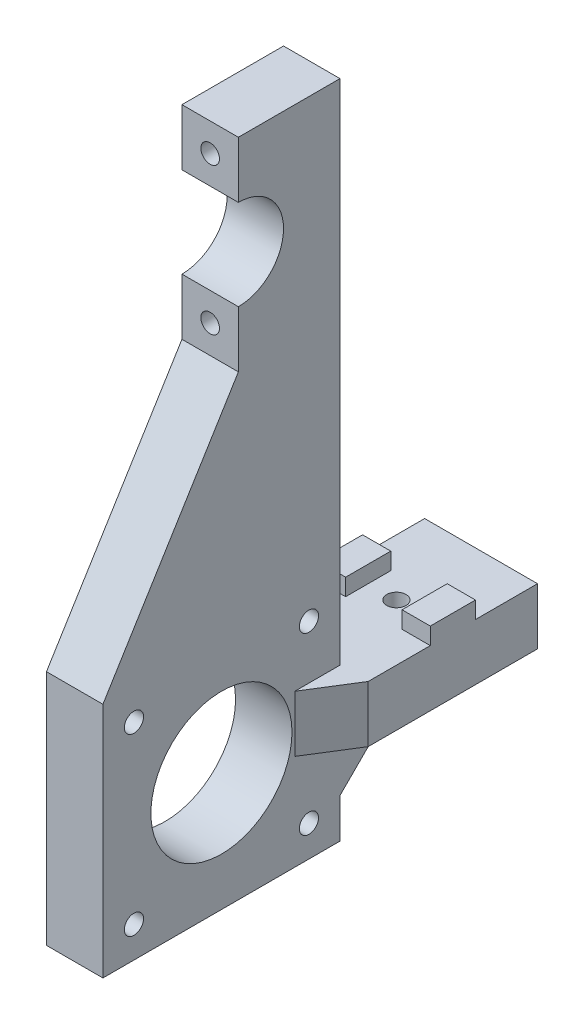
ISO-10303-21;
HEADER;
FILE_DESCRIPTION(('STEP AP214'),'2;1');
FILE_NAME('part.step','',(''),(''),'','','');
FILE_SCHEMA(('AUTOMOTIVE_DESIGN { 1 0 10303 214 1 1 1 1 }'));
ENDSEC;
DATA;
#1=APPLICATION_CONTEXT('core data for automotive mechanical design processes');
#2=APPLICATION_PROTOCOL_DEFINITION('international standard','automotive_design',2000,#1);
#3=PRODUCT_CONTEXT('',#1,'mechanical');
#4=PRODUCT('Part','Part','',(#3));
#5=PRODUCT_RELATED_PRODUCT_CATEGORY('part','',(#4));
#6=PRODUCT_DEFINITION_FORMATION('','',#4);
#7=PRODUCT_DEFINITION_CONTEXT('part definition',#1,'design');
#8=PRODUCT_DEFINITION('design','',#6,#7);
#9=PRODUCT_DEFINITION_SHAPE('','',#8);
#10=(LENGTH_UNIT() NAMED_UNIT(*) SI_UNIT(.MILLI.,.METRE.));
#11=(NAMED_UNIT(*) PLANE_ANGLE_UNIT() SI_UNIT($,.RADIAN.));
#12=(NAMED_UNIT(*) SI_UNIT($,.STERADIAN.) SOLID_ANGLE_UNIT());
#13=UNCERTAINTY_MEASURE_WITH_UNIT(LENGTH_MEASURE(1.E-05),#10,'distance_accuracy_value','');
#14=(GEOMETRIC_REPRESENTATION_CONTEXT(3) GLOBAL_UNCERTAINTY_ASSIGNED_CONTEXT((#13)) GLOBAL_UNIT_ASSIGNED_CONTEXT((#10,
#11,#12)) REPRESENTATION_CONTEXT('',''));
#15=CARTESIAN_POINT('',(0.,0.,0.));
#16=DIRECTION('',(0.,0.,1.));
#17=DIRECTION('',(1.,0.,0.));
#18=AXIS2_PLACEMENT_3D('',#15,#16,#17);
#19=CARTESIAN_POINT('',(5.,72.,18.));
#20=DIRECTION('',(1.,0.,0.));
#21=DIRECTION('',(0.,0.,-1.));
#22=AXIS2_PLACEMENT_3D('',#19,#20,#21);
#23=PLANE('',#22);
#24=CARTESIAN_POINT('',(5.,9.5,36.5));
#25=DIRECTION('',(-1.,0.,0.));
#26=DIRECTION('',(0.,0.,1.));
#27=AXIS2_PLACEMENT_3D('',#24,#25,#26);
#28=CIRCLE('',#27,3.15);
#29=CARTESIAN_POINT('',(5.,9.5,39.65));
#30=VERTEX_POINT('',#29);
#31=EDGE_CURVE('E248',#30,#30,#28,.T.);
#32=ORIENTED_EDGE('',*,*,#31,.F.);
#33=EDGE_LOOP('',(#32));
#34=FACE_BOUND('',#33,.T.);
#35=CARTESIAN_POINT('',(5.,-21.5,36.5));
#36=DIRECTION('',(-1.,0.,0.));
#37=DIRECTION('',(0.,0.,1.));
#38=AXIS2_PLACEMENT_3D('',#35,#36,#37);
#39=CIRCLE('',#38,3.15);
#40=CARTESIAN_POINT('',(5.,-21.5,39.65));
#41=VERTEX_POINT('',#40);
#42=EDGE_CURVE('E257',#41,#41,#39,.T.);
#43=ORIENTED_EDGE('',*,*,#42,.F.);
#44=EDGE_LOOP('',(#43));
#45=FACE_BOUND('',#44,.T.);
#46=CARTESIAN_POINT('',(5.,-21.5,5.5));
#47=DIRECTION('',(-1.,0.,0.));
#48=DIRECTION('',(0.,0.,1.));
#49=AXIS2_PLACEMENT_3D('',#46,#47,#48);
#50=CIRCLE('',#49,3.15);
#51=CARTESIAN_POINT('',(5.,-21.5,8.65));
#52=VERTEX_POINT('',#51);
#53=EDGE_CURVE('E266',#52,#52,#50,.T.);
#54=ORIENTED_EDGE('',*,*,#53,.F.);
#55=EDGE_LOOP('',(#54));
#56=FACE_BOUND('',#55,.T.);
#57=CARTESIAN_POINT('',(5.,-6.,21.));
#58=DIRECTION('',(1.,0.,0.));
#59=DIRECTION('',(0.,0.,-1.));
#60=AXIS2_PLACEMENT_3D('',#57,#58,#59);
#61=CIRCLE('',#60,12.5);
#62=CARTESIAN_POINT('',(5.,-6.,8.5));
#63=VERTEX_POINT('',#62);
#64=EDGE_CURVE('E269',#63,#63,#61,.T.);
#65=ORIENTED_EDGE('',*,*,#64,.T.);
#66=EDGE_LOOP('',(#65));
#67=FACE_BOUND('',#66,.T.);
#68=DIRECTION('',(0.,0.,1.));
#69=VECTOR('',#68,1.);
#70=CARTESIAN_POINT('',(5.,-10.,0.));
#71=LINE('',#70,#69);
#72=CARTESIAN_POINT('',(5.,-10.,-10.));
#73=VERTEX_POINT('',#72);
#74=CARTESIAN_POINT('',(5.,-10.,8.));
#75=VERTEX_POINT('',#74);
#76=EDGE_CURVE('E404',#73,#75,#71,.T.);
#77=ORIENTED_EDGE('',*,*,#76,.F.);
#78=DIRECTION('',(0.,0.707106781186548,-0.707106781186547));
#79=VECTOR('',#78,1.);
#80=CARTESIAN_POINT('',(5.,-10.,-10.));
#81=LINE('',#80,#79);
#82=CARTESIAN_POINT('',(5.,-20.,0.));
#83=VERTEX_POINT('',#82);
#84=EDGE_CURVE('E334',#83,#73,#81,.T.);
#85=ORIENTED_EDGE('',*,*,#84,.F.);
#86=DIRECTION('',(0.,1.,0.));
#87=VECTOR('',#86,1.);
#88=CARTESIAN_POINT('',(5.,-20.,0.));
#89=LINE('',#88,#87);
#90=CARTESIAN_POINT('',(5.,-27.,0.));
#91=VERTEX_POINT('',#90);
#92=EDGE_CURVE('E371',#91,#83,#89,.T.);
#93=ORIENTED_EDGE('',*,*,#92,.F.);
#94=DIRECTION('',(0.,0.,-1.));
#95=VECTOR('',#94,1.);
#96=CARTESIAN_POINT('',(5.,-27.,42.));
#97=LINE('',#96,#95);
#98=CARTESIAN_POINT('',(5.,-27.,42.));
#99=VERTEX_POINT('',#98);
#100=EDGE_CURVE('E369',#99,#91,#97,.T.);
#101=ORIENTED_EDGE('',*,*,#100,.F.);
#102=DIRECTION('',(0.,-1.,0.));
#103=VECTOR('',#102,1.);
#104=CARTESIAN_POINT('',(5.,15.,42.));
#105=LINE('',#104,#103);
#106=CARTESIAN_POINT('',(5.,15.,42.));
#107=VERTEX_POINT('',#106);
#108=EDGE_CURVE('E367',#107,#99,#105,.T.);
#109=ORIENTED_EDGE('',*,*,#108,.F.);
#110=DIRECTION('',(0.,-0.851658316704544,0.524097425664335));
#111=VECTOR('',#110,1.);
#112=CARTESIAN_POINT('',(5.,54.,18.));
#113=LINE('',#112,#111);
#114=CARTESIAN_POINT('',(5.,54.,18.));
#115=VERTEX_POINT('',#114);
#116=EDGE_CURVE('E365',#115,#107,#113,.T.);
#117=ORIENTED_EDGE('',*,*,#116,.F.);
#118=DIRECTION('',(0.,-1.,0.));
#119=VECTOR('',#118,1.);
#120=CARTESIAN_POINT('',(5.,64.,18.));
#121=LINE('',#120,#119);
#122=CARTESIAN_POINT('',(5.,64.,18.));
#123=VERTEX_POINT('',#122);
#124=EDGE_CURVE('E363',#123,#115,#121,.T.);
#125=ORIENTED_EDGE('',*,*,#124,.F.);
#126=CARTESIAN_POINT('',(5.,72.,18.));
#127=DIRECTION('',(-1.,0.,0.));
#128=DIRECTION('',(0.,0.,-1.));
#129=AXIS2_PLACEMENT_3D('',#126,#127,#128);
#130=CIRCLE('',#129,8.00000000000001);
#131=CARTESIAN_POINT('',(5.,80.,18.));
#132=VERTEX_POINT('',#131);
#133=EDGE_CURVE('E361',#132,#123,#130,.T.);
#134=ORIENTED_EDGE('',*,*,#133,.F.);
#135=DIRECTION('',(0.,-1.,0.));
#136=VECTOR('',#135,1.);
#137=CARTESIAN_POINT('',(5.,90.,18.));
#138=LINE('',#137,#136);
#139=CARTESIAN_POINT('',(5.,90.,18.));
#140=VERTEX_POINT('',#139);
#141=EDGE_CURVE('E359',#140,#132,#138,.T.);
#142=ORIENTED_EDGE('',*,*,#141,.F.);
#143=DIRECTION('',(0.,0.,1.));
#144=VECTOR('',#143,1.);
#145=CARTESIAN_POINT('',(5.,90.,0.));
#146=LINE('',#145,#144);
#147=CARTESIAN_POINT('',(5.,90.,0.));
#148=VERTEX_POINT('',#147);
#149=EDGE_CURVE('E357',#148,#140,#146,.T.);
#150=ORIENTED_EDGE('',*,*,#149,.F.);
#151=DIRECTION('',(0.,1.,0.));
#152=VECTOR('',#151,1.);
#153=CARTESIAN_POINT('',(5.,90.,0.));
#154=LINE('',#153,#152);
#155=CARTESIAN_POINT('',(5.,0.,0.));
#156=VERTEX_POINT('',#155);
#157=EDGE_CURVE('E330',#156,#148,#154,.T.);
#158=ORIENTED_EDGE('',*,*,#157,.F.);
#159=DIRECTION('',(0.,0.,1.));
#160=VECTOR('',#159,1.);
#161=CARTESIAN_POINT('',(5.,0.,0.));
#162=LINE('',#161,#160);
#163=CARTESIAN_POINT('',(5.,0.,8.));
#164=VERTEX_POINT('',#163);
#165=EDGE_CURVE('E438',#156,#164,#162,.T.);
#166=ORIENTED_EDGE('',*,*,#165,.T.);
#167=DIRECTION('',(0.,1.,0.));
#168=VECTOR('',#167,1.);
#169=CARTESIAN_POINT('',(5.,-10.,8.));
#170=LINE('',#169,#168);
#171=EDGE_CURVE('E447',#75,#164,#170,.T.);
#172=ORIENTED_EDGE('',*,*,#171,.F.);
#173=EDGE_LOOP('',(#77,#85,#93,#101,#109,#117,#125,#134,#142,#150,#158,#166,#172));
#174=FACE_BOUND('',#173,.T.);
#175=CARTESIAN_POINT('',(5.,9.5,5.50000000000001));
#176=DIRECTION('',(-1.,0.,0.));
#177=DIRECTION('',(0.,0.,1.));
#178=AXIS2_PLACEMENT_3D('',#175,#176,#177);
#179=CIRCLE('',#178,3.15);
#180=CARTESIAN_POINT('',(5.,9.5,8.65000000000001));
#181=VERTEX_POINT('',#180);
#182=EDGE_CURVE('E239',#181,#181,#179,.T.);
#183=ORIENTED_EDGE('',*,*,#182,.F.);
#184=EDGE_LOOP('',(#183));
#185=FACE_BOUND('',#184,.T.);
#186=ADVANCED_FACE('F35',(#34,#45,#56,#67,#174,#185),#23,.F.);
#187=CARTESIAN_POINT('',(0.,0.,0.));
#188=DIRECTION('',(0.,-1.,0.));
#189=DIRECTION('',(0.,0.,-1.));
#190=AXIS2_PLACEMENT_3D('',#187,#188,#189);
#191=PLANE('',#190);
#192=CARTESIAN_POINT('',(10.,0.,-15.));
#193=DIRECTION('',(0.,-1.,0.));
#194=DIRECTION('',(0.,0.,-1.));
#195=AXIS2_PLACEMENT_3D('',#192,#193,#194);
#196=CIRCLE('',#195,1.7);
#197=CARTESIAN_POINT('',(10.,0.,-16.7));
#198=VERTEX_POINT('',#197);
#199=EDGE_CURVE('E224',#198,#198,#196,.T.);
#200=ORIENTED_EDGE('',*,*,#199,.T.);
#201=EDGE_LOOP('',(#200));
#202=FACE_BOUND('',#201,.T.);
#203=DIRECTION('',(-1.,0.,0.));
#204=VECTOR('',#203,1.);
#205=CARTESIAN_POINT('',(20.,0.,-19.));
#206=LINE('',#205,#204);
#207=CARTESIAN_POINT('',(20.,0.,-19.));
#208=VERTEX_POINT('',#207);
#209=CARTESIAN_POINT('',(15.,0.,-19.));
#210=VERTEX_POINT('',#209);
#211=EDGE_CURVE('E275',#208,#210,#206,.T.);
#212=ORIENTED_EDGE('',*,*,#211,.F.);
#213=DIRECTION('',(0.,0.,-1.));
#214=VECTOR('',#213,1.);
#215=CARTESIAN_POINT('',(20.,0.,0.));
#216=LINE('',#215,#214);
#217=CARTESIAN_POINT('',(20.,0.,-30.));
#218=VERTEX_POINT('',#217);
#219=EDGE_CURVE('E431',#208,#218,#216,.T.);
#220=ORIENTED_EDGE('',*,*,#219,.T.);
#221=DIRECTION('',(-1.,0.,0.));
#222=VECTOR('',#221,1.);
#223=CARTESIAN_POINT('',(0.,0.,-30.));
#224=LINE('',#223,#222);
#225=CARTESIAN_POINT('',(0.,0.,-30.));
#226=VERTEX_POINT('',#225);
#227=EDGE_CURVE('E411',#218,#226,#224,.T.);
#228=ORIENTED_EDGE('',*,*,#227,.T.);
#229=DIRECTION('',(0.,0.,1.));
#230=VECTOR('',#229,1.);
#231=CARTESIAN_POINT('',(0.,0.,0.));
#232=LINE('',#231,#230);
#233=CARTESIAN_POINT('',(0.,0.,-19.));
#234=VERTEX_POINT('',#233);
#235=EDGE_CURVE('E424',#226,#234,#232,.T.);
#236=ORIENTED_EDGE('',*,*,#235,.T.);
#237=DIRECTION('',(-1.,0.,0.));
#238=VECTOR('',#237,1.);
#239=CARTESIAN_POINT('',(0.,0.,-19.));
#240=LINE('',#239,#238);
#241=CARTESIAN_POINT('',(5.,0.,-19.));
#242=VERTEX_POINT('',#241);
#243=EDGE_CURVE('E305',#242,#234,#240,.T.);
#244=ORIENTED_EDGE('',*,*,#243,.F.);
#245=DIRECTION('',(0.,0.,-1.));
#246=VECTOR('',#245,1.);
#247=CARTESIAN_POINT('',(5.,0.,-19.));
#248=LINE('',#247,#246);
#249=CARTESIAN_POINT('',(5.,0.,-11.));
#250=VERTEX_POINT('',#249);
#251=EDGE_CURVE('E314',#250,#242,#248,.T.);
#252=ORIENTED_EDGE('',*,*,#251,.F.);
#253=DIRECTION('',(1.,0.,0.));
#254=VECTOR('',#253,1.);
#255=CARTESIAN_POINT('',(0.,0.,-11.));
#256=LINE('',#255,#254);
#257=CARTESIAN_POINT('',(0.,0.,-11.));
#258=VERTEX_POINT('',#257);
#259=EDGE_CURVE('E300',#258,#250,#256,.T.);
#260=ORIENTED_EDGE('',*,*,#259,.F.);
#261=CARTESIAN_POINT('',(0.,0.,0.));
#262=VERTEX_POINT('',#261);
#263=EDGE_CURVE('E406',#258,#262,#232,.T.);
#264=ORIENTED_EDGE('',*,*,#263,.T.);
#265=DIRECTION('',(0.52999894000318,0.,0.847998304005088));
#266=VECTOR('',#265,1.);
#267=CARTESIAN_POINT('',(0.,0.,0.));
#268=LINE('',#267,#266);
#269=EDGE_CURVE('E426',#262,#164,#268,.T.);
#270=ORIENTED_EDGE('',*,*,#269,.T.);
#271=ORIENTED_EDGE('',*,*,#165,.F.);
#272=DIRECTION('',(-1.,0.,0.));
#273=VECTOR('',#272,1.);
#274=CARTESIAN_POINT('',(0.,0.,0.));
#275=LINE('',#274,#273);
#276=CARTESIAN_POINT('',(15.,0.,0.));
#277=VERTEX_POINT('',#276);
#278=EDGE_CURVE('E43',#277,#156,#275,.T.);
#279=ORIENTED_EDGE('',*,*,#278,.F.);
#280=DIRECTION('',(0.,0.,1.));
#281=VECTOR('',#280,1.);
#282=CARTESIAN_POINT('',(15.,0.,0.));
#283=LINE('',#282,#281);
#284=CARTESIAN_POINT('',(15.,0.,8.));
#285=VERTEX_POINT('',#284);
#286=EDGE_CURVE('E11',#277,#285,#283,.T.);
#287=ORIENTED_EDGE('',*,*,#286,.T.);
#288=DIRECTION('',(0.52999894000318,0.,-0.847998304005088));
#289=VECTOR('',#288,1.);
#290=CARTESIAN_POINT('',(15.,0.,8.));
#291=LINE('',#290,#289);
#292=CARTESIAN_POINT('',(20.,0.,0.));
#293=VERTEX_POINT('',#292);
#294=EDGE_CURVE('E428',#285,#293,#291,.T.);
#295=ORIENTED_EDGE('',*,*,#294,.T.);
#296=CARTESIAN_POINT('',(20.,0.,-11.));
#297=VERTEX_POINT('',#296);
#298=EDGE_CURVE('E432',#293,#297,#216,.T.);
#299=ORIENTED_EDGE('',*,*,#298,.T.);
#300=DIRECTION('',(1.,0.,0.));
#301=VECTOR('',#300,1.);
#302=CARTESIAN_POINT('',(20.,0.,-11.));
#303=LINE('',#302,#301);
#304=CARTESIAN_POINT('',(15.,0.,-11.));
#305=VERTEX_POINT('',#304);
#306=EDGE_CURVE('E55',#305,#297,#303,.T.);
#307=ORIENTED_EDGE('',*,*,#306,.F.);
#308=DIRECTION('',(0.,0.,1.));
#309=VECTOR('',#308,1.);
#310=CARTESIAN_POINT('',(15.,0.,-19.));
#311=LINE('',#310,#309);
#312=EDGE_CURVE('E50',#210,#305,#311,.T.);
#313=ORIENTED_EDGE('',*,*,#312,.F.);
#314=EDGE_LOOP('',(#212,#220,#228,#236,#244,#252,#260,#264,#270,#271,#279,#287,#295,#299,#307,#313));
#315=FACE_BOUND('',#314,.T.);
#316=ADVANCED_FACE('F476',(#202,#315),#191,.F.);
#317=CARTESIAN_POINT('',(0.,-10.,0.));
#318=DIRECTION('',(-1.,0.,0.));
#319=DIRECTION('',(0.,0.,1.));
#320=AXIS2_PLACEMENT_3D('',#317,#318,#319);
#321=PLANE('',#320);
#322=ORIENTED_EDGE('',*,*,#235,.F.);
#323=DIRECTION('',(0.,1.,0.));
#324=VECTOR('',#323,1.);
#325=CARTESIAN_POINT('',(0.,-10.,-30.));
#326=LINE('',#325,#324);
#327=CARTESIAN_POINT('',(0.,-10.,-30.));
#328=VERTEX_POINT('',#327);
#329=EDGE_CURVE('E436',#328,#226,#326,.T.);
#330=ORIENTED_EDGE('',*,*,#329,.F.);
#331=DIRECTION('',(0.,0.,1.));
#332=VECTOR('',#331,1.);
#333=CARTESIAN_POINT('',(0.,-10.,0.));
#334=LINE('',#333,#332);
#335=CARTESIAN_POINT('',(0.,-10.,0.));
#336=VERTEX_POINT('',#335);
#337=EDGE_CURVE('E407',#328,#336,#334,.T.);
#338=ORIENTED_EDGE('',*,*,#337,.T.);
#339=DIRECTION('',(0.,1.,0.));
#340=VECTOR('',#339,1.);
#341=CARTESIAN_POINT('',(0.,-10.,0.));
#342=LINE('',#341,#340);
#343=EDGE_CURVE('E423',#336,#262,#342,.T.);
#344=ORIENTED_EDGE('',*,*,#343,.T.);
#345=ORIENTED_EDGE('',*,*,#263,.F.);
#346=DIRECTION('',(0.,-1.,0.));
#347=VECTOR('',#346,1.);
#348=CARTESIAN_POINT('',(0.,3.,-11.));
#349=LINE('',#348,#347);
#350=CARTESIAN_POINT('',(0.,3.,-11.));
#351=VERTEX_POINT('',#350);
#352=EDGE_CURVE('E327',#351,#258,#349,.T.);
#353=ORIENTED_EDGE('',*,*,#352,.F.);
#354=DIRECTION('',(0.,0.,1.));
#355=VECTOR('',#354,1.);
#356=CARTESIAN_POINT('',(0.,3.,-19.));
#357=LINE('',#356,#355);
#358=CARTESIAN_POINT('',(0.,3.,-19.));
#359=VERTEX_POINT('',#358);
#360=EDGE_CURVE('E301',#359,#351,#357,.T.);
#361=ORIENTED_EDGE('',*,*,#360,.F.);
#362=DIRECTION('',(0.,-1.,0.));
#363=VECTOR('',#362,1.);
#364=CARTESIAN_POINT('',(0.,3.,-19.));
#365=LINE('',#364,#363);
#366=EDGE_CURVE('E311',#359,#234,#365,.T.);
#367=ORIENTED_EDGE('',*,*,#366,.T.);
#368=EDGE_LOOP('',(#322,#330,#338,#344,#345,#353,#361,#367));
#369=FACE_BOUND('',#368,.T.);
#370=ADVANCED_FACE('F37',(#369),#321,.T.);
#371=CARTESIAN_POINT('',(0.,-10.,-30.));
#372=DIRECTION('',(0.,0.,-1.));
#373=DIRECTION('',(-1.,0.,0.));
#374=AXIS2_PLACEMENT_3D('',#371,#372,#373);
#375=PLANE('',#374);
#376=ORIENTED_EDGE('',*,*,#227,.F.);
#377=DIRECTION('',(0.,1.,0.));
#378=VECTOR('',#377,1.);
#379=CARTESIAN_POINT('',(20.,-10.,-30.));
#380=LINE('',#379,#378);
#381=CARTESIAN_POINT('',(20.,-10.,-30.));
#382=VERTEX_POINT('',#381);
#383=EDGE_CURVE('E439',#382,#218,#380,.T.);
#384=ORIENTED_EDGE('',*,*,#383,.F.);
#385=DIRECTION('',(-1.,0.,0.));
#386=VECTOR('',#385,1.);
#387=CARTESIAN_POINT('',(0.,-10.,-30.));
#388=LINE('',#387,#386);
#389=EDGE_CURVE('E420',#382,#328,#388,.T.);
#390=ORIENTED_EDGE('',*,*,#389,.T.);
#391=ORIENTED_EDGE('',*,*,#329,.T.);
#392=EDGE_LOOP('',(#376,#384,#390,#391));
#393=FACE_BOUND('',#392,.T.);
#394=ADVANCED_FACE('F500',(#393),#375,.T.);
#395=CARTESIAN_POINT('',(20.,-10.,0.));
#396=DIRECTION('',(1.,0.,0.));
#397=DIRECTION('',(0.,0.,-1.));
#398=AXIS2_PLACEMENT_3D('',#395,#396,#397);
#399=PLANE('',#398);
#400=ORIENTED_EDGE('',*,*,#298,.F.);
#401=DIRECTION('',(0.,1.,0.));
#402=VECTOR('',#401,1.);
#403=CARTESIAN_POINT('',(20.,-10.,0.));
#404=LINE('',#403,#402);
#405=CARTESIAN_POINT('',(20.,-10.,0.));
#406=VERTEX_POINT('',#405);
#407=EDGE_CURVE('E442',#406,#293,#404,.T.);
#408=ORIENTED_EDGE('',*,*,#407,.F.);
#409=DIRECTION('',(0.,0.,-1.));
#410=VECTOR('',#409,1.);
#411=CARTESIAN_POINT('',(20.,-10.,0.));
#412=LINE('',#411,#410);
#413=EDGE_CURVE('E417',#406,#382,#412,.T.);
#414=ORIENTED_EDGE('',*,*,#413,.T.);
#415=ORIENTED_EDGE('',*,*,#383,.T.);
#416=ORIENTED_EDGE('',*,*,#219,.F.);
#417=DIRECTION('',(0.,-1.,0.));
#418=VECTOR('',#417,1.);
#419=CARTESIAN_POINT('',(20.,3.,-19.));
#420=LINE('',#419,#418);
#421=CARTESIAN_POINT('',(20.,3.,-19.));
#422=VERTEX_POINT('',#421);
#423=EDGE_CURVE('E297',#422,#208,#420,.T.);
#424=ORIENTED_EDGE('',*,*,#423,.F.);
#425=DIRECTION('',(0.,0.,-1.));
#426=VECTOR('',#425,1.);
#427=CARTESIAN_POINT('',(20.,3.,-19.));
#428=LINE('',#427,#426);
#429=CARTESIAN_POINT('',(20.,3.,-11.));
#430=VERTEX_POINT('',#429);
#431=EDGE_CURVE('E276',#430,#422,#428,.T.);
#432=ORIENTED_EDGE('',*,*,#431,.F.);
#433=DIRECTION('',(0.,-1.,0.));
#434=VECTOR('',#433,1.);
#435=CARTESIAN_POINT('',(20.,3.,-11.));
#436=LINE('',#435,#434);
#437=EDGE_CURVE('E285',#430,#297,#436,.T.);
#438=ORIENTED_EDGE('',*,*,#437,.T.);
#439=EDGE_LOOP('',(#400,#408,#414,#415,#416,#424,#432,#438));
#440=FACE_BOUND('',#439,.T.);
#441=ADVANCED_FACE('F483',(#440),#399,.T.);
#442=CARTESIAN_POINT('',(15.,-10.,8.));
#443=DIRECTION('',(0.847998304005088,0.,0.52999894000318));
#444=DIRECTION('',(0.52999894000318,0.,-0.847998304005088));
#445=AXIS2_PLACEMENT_3D('',#442,#443,#444);
#446=PLANE('',#445);
#447=ORIENTED_EDGE('',*,*,#294,.F.);
#448=DIRECTION('',(0.,1.,0.));
#449=VECTOR('',#448,1.);
#450=CARTESIAN_POINT('',(15.,-10.,8.));
#451=LINE('',#450,#449);
#452=CARTESIAN_POINT('',(15.,-10.,8.));
#453=VERTEX_POINT('',#452);
#454=EDGE_CURVE('E444',#453,#285,#451,.T.);
#455=ORIENTED_EDGE('',*,*,#454,.F.);
#456=DIRECTION('',(0.52999894000318,0.,-0.847998304005088));
#457=VECTOR('',#456,1.);
#458=CARTESIAN_POINT('',(15.,-10.,8.));
#459=LINE('',#458,#457);
#460=EDGE_CURVE('E414',#453,#406,#459,.T.);
#461=ORIENTED_EDGE('',*,*,#460,.T.);
#462=ORIENTED_EDGE('',*,*,#407,.T.);
#463=EDGE_LOOP('',(#447,#455,#461,#462));
#464=FACE_BOUND('',#463,.T.);
#465=ADVANCED_FACE('F478',(#464),#446,.T.);
#466=CARTESIAN_POINT('',(0.,-10.,0.));
#467=DIRECTION('',(-0.847998304005088,0.,0.52999894000318));
#468=DIRECTION('',(0.52999894000318,0.,0.847998304005088));
#469=AXIS2_PLACEMENT_3D('',#466,#467,#468);
#470=PLANE('',#469);
#471=ORIENTED_EDGE('',*,*,#269,.F.);
#472=ORIENTED_EDGE('',*,*,#343,.F.);
#473=DIRECTION('',(0.52999894000318,0.,0.847998304005088));
#474=VECTOR('',#473,1.);
#475=CARTESIAN_POINT('',(0.,-10.,0.));
#476=LINE('',#475,#474);
#477=EDGE_CURVE('E410',#336,#75,#476,.T.);
#478=ORIENTED_EDGE('',*,*,#477,.T.);
#479=ORIENTED_EDGE('',*,*,#171,.T.);
#480=EDGE_LOOP('',(#471,#472,#478,#479));
#481=FACE_BOUND('',#480,.T.);
#482=ADVANCED_FACE('F520',(#481),#470,.T.);
#483=CARTESIAN_POINT('',(0.,-10.,0.));
#484=DIRECTION('',(0.,-1.,0.));
#485=DIRECTION('',(0.,0.,-1.));
#486=AXIS2_PLACEMENT_3D('',#483,#484,#485);
#487=PLANE('',#486);
#488=CARTESIAN_POINT('',(10.,-10.,-15.));
#489=DIRECTION('',(0.,-1.,0.));
#490=DIRECTION('',(0.,0.,-1.));
#491=AXIS2_PLACEMENT_3D('',#488,#489,#490);
#492=CIRCLE('',#491,3.15);
#493=CARTESIAN_POINT('',(10.,-10.,-18.15));
#494=VERTEX_POINT('',#493);
#495=EDGE_CURVE('E230',#494,#494,#492,.T.);
#496=ORIENTED_EDGE('',*,*,#495,.F.);
#497=EDGE_LOOP('',(#496));
#498=FACE_BOUND('',#497,.T.);
#499=ORIENTED_EDGE('',*,*,#460,.F.);
#500=DIRECTION('',(0.,0.,1.));
#501=VECTOR('',#500,1.);
#502=CARTESIAN_POINT('',(15.,-10.,0.));
#503=LINE('',#502,#501);
#504=CARTESIAN_POINT('',(15.,-10.,-10.));
#505=VERTEX_POINT('',#504);
#506=EDGE_CURVE('E353',#505,#453,#503,.T.);
#507=ORIENTED_EDGE('',*,*,#506,.F.);
#508=DIRECTION('',(-1.,0.,0.));
#509=VECTOR('',#508,1.);
#510=CARTESIAN_POINT('',(15.,-10.,-10.));
#511=LINE('',#510,#509);
#512=EDGE_CURVE('E355',#505,#73,#511,.T.);
#513=ORIENTED_EDGE('',*,*,#512,.T.);
#514=ORIENTED_EDGE('',*,*,#76,.T.);
#515=ORIENTED_EDGE('',*,*,#477,.F.);
#516=ORIENTED_EDGE('',*,*,#337,.F.);
#517=ORIENTED_EDGE('',*,*,#389,.F.);
#518=ORIENTED_EDGE('',*,*,#413,.F.);
#519=EDGE_LOOP('',(#499,#507,#513,#514,#515,#516,#517,#518));
#520=FACE_BOUND('',#519,.T.);
#521=ADVANCED_FACE('F526',(#498,#520),#487,.T.);
#522=CARTESIAN_POINT('',(15.,90.,0.));
#523=DIRECTION('',(0.,0.,1.));
#524=DIRECTION('',(0.,-1.,0.));
#525=AXIS2_PLACEMENT_3D('',#522,#523,#524);
#526=PLANE('',#525);
#527=DIRECTION('',(0.,1.,0.));
#528=VECTOR('',#527,1.);
#529=CARTESIAN_POINT('',(15.,90.,0.));
#530=LINE('',#529,#528);
#531=CARTESIAN_POINT('',(15.,90.,0.));
#532=VERTEX_POINT('',#531);
#533=EDGE_CURVE('E331',#277,#532,#530,.T.);
#534=ORIENTED_EDGE('',*,*,#533,.F.);
#535=ORIENTED_EDGE('',*,*,#278,.T.);
#536=ORIENTED_EDGE('',*,*,#157,.T.);
#537=DIRECTION('',(-1.,0.,0.));
#538=VECTOR('',#537,1.);
#539=CARTESIAN_POINT('',(15.,90.,0.));
#540=LINE('',#539,#538);
#541=EDGE_CURVE('E401',#532,#148,#540,.T.);
#542=ORIENTED_EDGE('',*,*,#541,.F.);
#543=EDGE_LOOP('',(#534,#535,#536,#542));
#544=FACE_BOUND('',#543,.T.);
#545=ADVANCED_FACE('F457',(#544),#526,.F.);
#546=CARTESIAN_POINT('',(15.,90.,0.));
#547=DIRECTION('',(0.,-1.,0.));
#548=DIRECTION('',(0.,0.,-1.));
#549=AXIS2_PLACEMENT_3D('',#546,#547,#548);
#550=PLANE('',#549);
#551=ORIENTED_EDGE('',*,*,#149,.T.);
#552=DIRECTION('',(-1.,0.,0.));
#553=VECTOR('',#552,1.);
#554=CARTESIAN_POINT('',(15.,90.,18.));
#555=LINE('',#554,#553);
#556=CARTESIAN_POINT('',(15.,90.,18.));
#557=VERTEX_POINT('',#556);
#558=EDGE_CURVE('E398',#557,#140,#555,.T.);
#559=ORIENTED_EDGE('',*,*,#558,.F.);
#560=DIRECTION('',(0.,0.,1.));
#561=VECTOR('',#560,1.);
#562=CARTESIAN_POINT('',(15.,90.,0.));
#563=LINE('',#562,#561);
#564=EDGE_CURVE('E333',#532,#557,#563,.T.);
#565=ORIENTED_EDGE('',*,*,#564,.F.);
#566=ORIENTED_EDGE('',*,*,#541,.T.);
#567=EDGE_LOOP('',(#551,#559,#565,#566));
#568=FACE_BOUND('',#567,.T.);
#569=ADVANCED_FACE('F469',(#568),#550,.F.);
#570=CARTESIAN_POINT('',(15.,90.,18.));
#571=DIRECTION('',(0.,0.,-1.));
#572=DIRECTION('',(-1.,0.,0.));
#573=AXIS2_PLACEMENT_3D('',#570,#571,#572);
#574=PLANE('',#573);
#575=CARTESIAN_POINT('',(10.,85.,18.));
#576=DIRECTION('',(0.,0.,1.));
#577=DIRECTION('',(0.,-1.,0.));
#578=AXIS2_PLACEMENT_3D('',#575,#576,#577);
#579=CIRCLE('',#578,1.65);
#580=CARTESIAN_POINT('',(10.,83.35,18.));
#581=VERTEX_POINT('',#580);
#582=EDGE_CURVE('E213',#581,#581,#579,.T.);
#583=ORIENTED_EDGE('',*,*,#582,.F.);
#584=EDGE_LOOP('',(#583));
#585=FACE_BOUND('',#584,.T.);
#586=ORIENTED_EDGE('',*,*,#141,.T.);
#587=DIRECTION('',(-1.,0.,0.));
#588=VECTOR('',#587,1.);
#589=CARTESIAN_POINT('',(15.,80.,18.));
#590=LINE('',#589,#588);
#591=CARTESIAN_POINT('',(15.,80.,18.));
#592=VERTEX_POINT('',#591);
#593=EDGE_CURVE('E395',#592,#132,#590,.T.);
#594=ORIENTED_EDGE('',*,*,#593,.F.);
#595=DIRECTION('',(0.,-1.,0.));
#596=VECTOR('',#595,1.);
#597=CARTESIAN_POINT('',(15.,90.,18.));
#598=LINE('',#597,#596);
#599=EDGE_CURVE('E336',#557,#592,#598,.T.);
#600=ORIENTED_EDGE('',*,*,#599,.F.);
#601=ORIENTED_EDGE('',*,*,#558,.T.);
#602=EDGE_LOOP('',(#586,#594,#600,#601));
#603=FACE_BOUND('',#602,.T.);
#604=ADVANCED_FACE('F559',(#585,#603),#574,.F.);
#605=CARTESIAN_POINT('',(15.,72.,18.));
#606=DIRECTION('',(-1.,0.,0.));
#607=DIRECTION('',(0.,0.,1.));
#608=AXIS2_PLACEMENT_3D('',#605,#606,#607);
#609=CYLINDRICAL_SURFACE('',#608,8.00000000000001);
#610=ORIENTED_EDGE('',*,*,#133,.T.);
#611=DIRECTION('',(-1.,0.,0.));
#612=VECTOR('',#611,1.);
#613=CARTESIAN_POINT('',(15.,64.,18.));
#614=LINE('',#613,#612);
#615=CARTESIAN_POINT('',(15.,64.,18.));
#616=VERTEX_POINT('',#615);
#617=EDGE_CURVE('E392',#616,#123,#614,.T.);
#618=ORIENTED_EDGE('',*,*,#617,.F.);
#619=CARTESIAN_POINT('',(15.,72.,18.));
#620=DIRECTION('',(-1.,0.,0.));
#621=DIRECTION('',(0.,0.,-1.));
#622=AXIS2_PLACEMENT_3D('',#619,#620,#621);
#623=CIRCLE('',#622,8.00000000000001);
#624=EDGE_CURVE('E338',#592,#616,#623,.T.);
#625=ORIENTED_EDGE('',*,*,#624,.F.);
#626=ORIENTED_EDGE('',*,*,#593,.T.);
#627=EDGE_LOOP('',(#610,#618,#625,#626));
#628=FACE_BOUND('',#627,.T.);
#629=ADVANCED_FACE('F557',(#628),#609,.F.);
#630=CARTESIAN_POINT('',(15.,64.,18.));
#631=DIRECTION('',(0.,0.,-1.));
#632=DIRECTION('',(0.,1.,0.));
#633=AXIS2_PLACEMENT_3D('',#630,#631,#632);
#634=PLANE('',#633);
#635=CARTESIAN_POINT('',(10.,59.,18.));
#636=DIRECTION('',(0.,0.,1.));
#637=DIRECTION('',(0.,-1.,0.));
#638=AXIS2_PLACEMENT_3D('',#635,#636,#637);
#639=CIRCLE('',#638,1.65);
#640=CARTESIAN_POINT('',(10.,57.35,18.));
#641=VERTEX_POINT('',#640);
#642=EDGE_CURVE('E221',#641,#641,#639,.T.);
#643=ORIENTED_EDGE('',*,*,#642,.F.);
#644=EDGE_LOOP('',(#643));
#645=FACE_BOUND('',#644,.T.);
#646=ORIENTED_EDGE('',*,*,#124,.T.);
#647=DIRECTION('',(-1.,0.,0.));
#648=VECTOR('',#647,1.);
#649=CARTESIAN_POINT('',(15.,54.,18.));
#650=LINE('',#649,#648);
#651=CARTESIAN_POINT('',(15.,54.,18.));
#652=VERTEX_POINT('',#651);
#653=EDGE_CURVE('E389',#652,#115,#650,.T.);
#654=ORIENTED_EDGE('',*,*,#653,.F.);
#655=DIRECTION('',(0.,-1.,0.));
#656=VECTOR('',#655,1.);
#657=CARTESIAN_POINT('',(15.,64.,18.));
#658=LINE('',#657,#656);
#659=EDGE_CURVE('E340',#616,#652,#658,.T.);
#660=ORIENTED_EDGE('',*,*,#659,.F.);
#661=ORIENTED_EDGE('',*,*,#617,.T.);
#662=EDGE_LOOP('',(#646,#654,#660,#661));
#663=FACE_BOUND('',#662,.T.);
#664=ADVANCED_FACE('F552',(#645,#663),#634,.F.);
#665=CARTESIAN_POINT('',(15.,54.,18.));
#666=DIRECTION('',(0.,-0.524097425664335,-0.851658316704544));
#667=DIRECTION('',(0.,0.851658316704544,-0.524097425664335));
#668=AXIS2_PLACEMENT_3D('',#665,#666,#667);
#669=PLANE('',#668);
#670=ORIENTED_EDGE('',*,*,#116,.T.);
#671=DIRECTION('',(-1.,0.,0.));
#672=VECTOR('',#671,1.);
#673=CARTESIAN_POINT('',(15.,15.,42.));
#674=LINE('',#673,#672);
#675=CARTESIAN_POINT('',(15.,15.,42.));
#676=VERTEX_POINT('',#675);
#677=EDGE_CURVE('E386',#676,#107,#674,.T.);
#678=ORIENTED_EDGE('',*,*,#677,.F.);
#679=DIRECTION('',(0.,-0.851658316704544,0.524097425664335));
#680=VECTOR('',#679,1.);
#681=CARTESIAN_POINT('',(15.,54.,18.));
#682=LINE('',#681,#680);
#683=EDGE_CURVE('E342',#652,#676,#682,.T.);
#684=ORIENTED_EDGE('',*,*,#683,.F.);
#685=ORIENTED_EDGE('',*,*,#653,.T.);
#686=EDGE_LOOP('',(#670,#678,#684,#685));
#687=FACE_BOUND('',#686,.T.);
#688=ADVANCED_FACE('F548',(#687),#669,.F.);
#689=CARTESIAN_POINT('',(15.,15.,42.));
#690=DIRECTION('',(0.,0.,-1.));
#691=DIRECTION('',(0.,1.,0.));
#692=AXIS2_PLACEMENT_3D('',#689,#690,#691);
#693=PLANE('',#692);
#694=ORIENTED_EDGE('',*,*,#108,.T.);
#695=DIRECTION('',(-1.,0.,0.));
#696=VECTOR('',#695,1.);
#697=CARTESIAN_POINT('',(15.,-27.,42.));
#698=LINE('',#697,#696);
#699=CARTESIAN_POINT('',(15.,-27.,42.));
#700=VERTEX_POINT('',#699);
#701=EDGE_CURVE('E383',#700,#99,#698,.T.);
#702=ORIENTED_EDGE('',*,*,#701,.F.);
#703=DIRECTION('',(0.,-1.,0.));
#704=VECTOR('',#703,1.);
#705=CARTESIAN_POINT('',(15.,15.,42.));
#706=LINE('',#705,#704);
#707=EDGE_CURVE('E344',#676,#700,#706,.T.);
#708=ORIENTED_EDGE('',*,*,#707,.F.);
#709=ORIENTED_EDGE('',*,*,#677,.T.);
#710=EDGE_LOOP('',(#694,#702,#708,#709));
#711=FACE_BOUND('',#710,.T.);
#712=ADVANCED_FACE('F544',(#711),#693,.F.);
#713=CARTESIAN_POINT('',(15.,-27.,42.));
#714=DIRECTION('',(0.,1.,0.));
#715=DIRECTION('',(0.,0.,1.));
#716=AXIS2_PLACEMENT_3D('',#713,#714,#715);
#717=PLANE('',#716);
#718=ORIENTED_EDGE('',*,*,#100,.T.);
#719=DIRECTION('',(-1.,0.,0.));
#720=VECTOR('',#719,1.);
#721=CARTESIAN_POINT('',(15.,-27.,0.));
#722=LINE('',#721,#720);
#723=CARTESIAN_POINT('',(15.,-27.,0.));
#724=VERTEX_POINT('',#723);
#725=EDGE_CURVE('E380',#724,#91,#722,.T.);
#726=ORIENTED_EDGE('',*,*,#725,.F.);
#727=DIRECTION('',(0.,0.,-1.));
#728=VECTOR('',#727,1.);
#729=CARTESIAN_POINT('',(15.,-27.,42.));
#730=LINE('',#729,#728);
#731=EDGE_CURVE('E346',#700,#724,#730,.T.);
#732=ORIENTED_EDGE('',*,*,#731,.F.);
#733=ORIENTED_EDGE('',*,*,#701,.T.);
#734=EDGE_LOOP('',(#718,#726,#732,#733));
#735=FACE_BOUND('',#734,.T.);
#736=ADVANCED_FACE('F539',(#735),#717,.F.);
#737=CARTESIAN_POINT('',(15.,-20.,0.));
#738=DIRECTION('',(0.,0.,1.));
#739=DIRECTION('',(0.,-1.,0.));
#740=AXIS2_PLACEMENT_3D('',#737,#738,#739);
#741=PLANE('',#740);
#742=ORIENTED_EDGE('',*,*,#92,.T.);
#743=DIRECTION('',(-1.,0.,0.));
#744=VECTOR('',#743,1.);
#745=CARTESIAN_POINT('',(15.,-20.,0.));
#746=LINE('',#745,#744);
#747=CARTESIAN_POINT('',(15.,-20.,0.));
#748=VERTEX_POINT('',#747);
#749=EDGE_CURVE('E377',#748,#83,#746,.T.);
#750=ORIENTED_EDGE('',*,*,#749,.F.);
#751=DIRECTION('',(0.,1.,0.));
#752=VECTOR('',#751,1.);
#753=CARTESIAN_POINT('',(15.,-20.,0.));
#754=LINE('',#753,#752);
#755=EDGE_CURVE('E348',#724,#748,#754,.T.);
#756=ORIENTED_EDGE('',*,*,#755,.F.);
#757=ORIENTED_EDGE('',*,*,#725,.T.);
#758=EDGE_LOOP('',(#742,#750,#756,#757));
#759=FACE_BOUND('',#758,.T.);
#760=ADVANCED_FACE('F533',(#759),#741,.F.);
#761=CARTESIAN_POINT('',(15.,-10.,-10.));
#762=DIRECTION('',(0.,0.707106781186547,0.707106781186548));
#763=DIRECTION('',(0.,-0.707106781186548,0.707106781186547));
#764=AXIS2_PLACEMENT_3D('',#761,#762,#763);
#765=PLANE('',#764);
#766=ORIENTED_EDGE('',*,*,#84,.T.);
#767=ORIENTED_EDGE('',*,*,#512,.F.);
#768=DIRECTION('',(0.,0.707106781186548,-0.707106781186547));
#769=VECTOR('',#768,1.);
#770=CARTESIAN_POINT('',(15.,-10.,-10.));
#771=LINE('',#770,#769);
#772=EDGE_CURVE('E350',#748,#505,#771,.T.);
#773=ORIENTED_EDGE('',*,*,#772,.F.);
#774=ORIENTED_EDGE('',*,*,#749,.T.);
#775=EDGE_LOOP('',(#766,#767,#773,#774));
#776=FACE_BOUND('',#775,.T.);
#777=ADVANCED_FACE('F529',(#776),#765,.F.);
#778=CARTESIAN_POINT('',(15.,72.,18.));
#779=DIRECTION('',(1.,0.,0.));
#780=DIRECTION('',(0.,0.,-1.));
#781=AXIS2_PLACEMENT_3D('',#778,#779,#780);
#782=PLANE('',#781);
#783=CARTESIAN_POINT('',(15.,9.5,5.50000000000001));
#784=DIRECTION('',(-1.,0.,0.));
#785=DIRECTION('',(0.,0.,1.));
#786=AXIS2_PLACEMENT_3D('',#783,#784,#785);
#787=CIRCLE('',#786,1.7);
#788=CARTESIAN_POINT('',(15.,9.5,7.2));
#789=VERTEX_POINT('',#788);
#790=EDGE_CURVE('E233',#789,#789,#787,.T.);
#791=ORIENTED_EDGE('',*,*,#790,.T.);
#792=EDGE_LOOP('',(#791));
#793=FACE_BOUND('',#792,.T.);
#794=CARTESIAN_POINT('',(15.,9.5,36.5));
#795=DIRECTION('',(-1.,0.,0.));
#796=DIRECTION('',(0.,0.,1.));
#797=AXIS2_PLACEMENT_3D('',#794,#795,#796);
#798=CIRCLE('',#797,1.7);
#799=CARTESIAN_POINT('',(15.,9.5,38.2));
#800=VERTEX_POINT('',#799);
#801=EDGE_CURVE('E242',#800,#800,#798,.T.);
#802=ORIENTED_EDGE('',*,*,#801,.T.);
#803=EDGE_LOOP('',(#802));
#804=FACE_BOUND('',#803,.T.);
#805=CARTESIAN_POINT('',(15.,-21.5,36.5));
#806=DIRECTION('',(-1.,0.,0.));
#807=DIRECTION('',(0.,0.,1.));
#808=AXIS2_PLACEMENT_3D('',#805,#806,#807);
#809=CIRCLE('',#808,1.7);
#810=CARTESIAN_POINT('',(15.,-21.5,38.2));
#811=VERTEX_POINT('',#810);
#812=EDGE_CURVE('E251',#811,#811,#809,.T.);
#813=ORIENTED_EDGE('',*,*,#812,.T.);
#814=EDGE_LOOP('',(#813));
#815=FACE_BOUND('',#814,.T.);
#816=CARTESIAN_POINT('',(15.,-21.5,5.5));
#817=DIRECTION('',(-1.,0.,0.));
#818=DIRECTION('',(0.,0.,1.));
#819=AXIS2_PLACEMENT_3D('',#816,#817,#818);
#820=CIRCLE('',#819,1.7);
#821=CARTESIAN_POINT('',(15.,-21.5,7.2));
#822=VERTEX_POINT('',#821);
#823=EDGE_CURVE('E260',#822,#822,#820,.T.);
#824=ORIENTED_EDGE('',*,*,#823,.T.);
#825=EDGE_LOOP('',(#824));
#826=FACE_BOUND('',#825,.T.);
#827=CARTESIAN_POINT('',(15.,-6.,21.));
#828=DIRECTION('',(1.,0.,0.));
#829=DIRECTION('',(0.,0.,-1.));
#830=AXIS2_PLACEMENT_3D('',#827,#828,#829);
#831=CIRCLE('',#830,12.5);
#832=CARTESIAN_POINT('',(15.,-6.,8.5));
#833=VERTEX_POINT('',#832);
#834=EDGE_CURVE('E272',#833,#833,#831,.T.);
#835=ORIENTED_EDGE('',*,*,#834,.F.);
#836=EDGE_LOOP('',(#835));
#837=FACE_BOUND('',#836,.T.);
#838=ORIENTED_EDGE('',*,*,#506,.T.);
#839=ORIENTED_EDGE('',*,*,#454,.T.);
#840=ORIENTED_EDGE('',*,*,#286,.F.);
#841=ORIENTED_EDGE('',*,*,#533,.T.);
#842=ORIENTED_EDGE('',*,*,#564,.T.);
#843=ORIENTED_EDGE('',*,*,#599,.T.);
#844=ORIENTED_EDGE('',*,*,#624,.T.);
#845=ORIENTED_EDGE('',*,*,#659,.T.);
#846=ORIENTED_EDGE('',*,*,#683,.T.);
#847=ORIENTED_EDGE('',*,*,#707,.T.);
#848=ORIENTED_EDGE('',*,*,#731,.T.);
#849=ORIENTED_EDGE('',*,*,#755,.T.);
#850=ORIENTED_EDGE('',*,*,#772,.T.);
#851=EDGE_LOOP('',(#838,#839,#840,#841,#842,#843,#844,#845,#846,#847,#848,#849,#850));
#852=FACE_BOUND('',#851,.T.);
#853=ADVANCED_FACE('F472',(#793,#804,#815,#826,#837,#852),#782,.T.);
#854=CARTESIAN_POINT('',(0.,3.,-11.));
#855=DIRECTION('',(0.,0.,-1.));
#856=DIRECTION('',(-1.,0.,0.));
#857=AXIS2_PLACEMENT_3D('',#854,#855,#856);
#858=PLANE('',#857);
#859=ORIENTED_EDGE('',*,*,#259,.T.);
#860=DIRECTION('',(0.,-1.,0.));
#861=VECTOR('',#860,1.);
#862=CARTESIAN_POINT('',(5.,3.,-11.));
#863=LINE('',#862,#861);
#864=CARTESIAN_POINT('',(5.,3.,-11.));
#865=VERTEX_POINT('',#864);
#866=EDGE_CURVE('E324',#865,#250,#863,.T.);
#867=ORIENTED_EDGE('',*,*,#866,.F.);
#868=DIRECTION('',(1.,0.,0.));
#869=VECTOR('',#868,1.);
#870=CARTESIAN_POINT('',(0.,3.,-11.));
#871=LINE('',#870,#869);
#872=EDGE_CURVE('E304',#351,#865,#871,.T.);
#873=ORIENTED_EDGE('',*,*,#872,.F.);
#874=ORIENTED_EDGE('',*,*,#352,.T.);
#875=EDGE_LOOP('',(#859,#867,#873,#874));
#876=FACE_BOUND('',#875,.T.);
#877=ADVANCED_FACE('F516',(#876),#858,.F.);
#878=CARTESIAN_POINT('',(5.,3.,-19.));
#879=DIRECTION('',(-1.,0.,0.));
#880=DIRECTION('',(0.,0.,1.));
#881=AXIS2_PLACEMENT_3D('',#878,#879,#880);
#882=PLANE('',#881);
#883=ORIENTED_EDGE('',*,*,#251,.T.);
#884=DIRECTION('',(0.,-1.,0.));
#885=VECTOR('',#884,1.);
#886=CARTESIAN_POINT('',(5.,3.,-19.));
#887=LINE('',#886,#885);
#888=CARTESIAN_POINT('',(5.,3.,-19.));
#889=VERTEX_POINT('',#888);
#890=EDGE_CURVE('E321',#889,#242,#887,.T.);
#891=ORIENTED_EDGE('',*,*,#890,.F.);
#892=DIRECTION('',(0.,0.,-1.));
#893=VECTOR('',#892,1.);
#894=CARTESIAN_POINT('',(5.,3.,-19.));
#895=LINE('',#894,#893);
#896=EDGE_CURVE('E307',#865,#889,#895,.T.);
#897=ORIENTED_EDGE('',*,*,#896,.F.);
#898=ORIENTED_EDGE('',*,*,#866,.T.);
#899=EDGE_LOOP('',(#883,#891,#897,#898));
#900=FACE_BOUND('',#899,.T.);
#901=ADVANCED_FACE('F512',(#900),#882,.F.);
#902=CARTESIAN_POINT('',(0.,3.,-19.));
#903=DIRECTION('',(0.,0.,1.));
#904=DIRECTION('',(1.,0.,0.));
#905=AXIS2_PLACEMENT_3D('',#902,#903,#904);
#906=PLANE('',#905);
#907=ORIENTED_EDGE('',*,*,#243,.T.);
#908=ORIENTED_EDGE('',*,*,#366,.F.);
#909=DIRECTION('',(-1.,0.,0.));
#910=VECTOR('',#909,1.);
#911=CARTESIAN_POINT('',(0.,3.,-19.));
#912=LINE('',#911,#910);
#913=EDGE_CURVE('E309',#889,#359,#912,.T.);
#914=ORIENTED_EDGE('',*,*,#913,.F.);
#915=ORIENTED_EDGE('',*,*,#890,.T.);
#916=EDGE_LOOP('',(#907,#908,#914,#915));
#917=FACE_BOUND('',#916,.T.);
#918=ADVANCED_FACE('F507',(#917),#906,.F.);
#919=CARTESIAN_POINT('',(0.,3.,0.));
#920=DIRECTION('',(0.,1.,0.));
#921=DIRECTION('',(0.,0.,1.));
#922=AXIS2_PLACEMENT_3D('',#919,#920,#921);
#923=PLANE('',#922);
#924=ORIENTED_EDGE('',*,*,#360,.T.);
#925=ORIENTED_EDGE('',*,*,#872,.T.);
#926=ORIENTED_EDGE('',*,*,#896,.T.);
#927=ORIENTED_EDGE('',*,*,#913,.T.);
#928=EDGE_LOOP('',(#924,#925,#926,#927));
#929=FACE_BOUND('',#928,.T.);
#930=ADVANCED_FACE('F666',(#929),#923,.T.);
#931=CARTESIAN_POINT('',(20.,3.,-19.));
#932=DIRECTION('',(0.,0.,1.));
#933=DIRECTION('',(1.,0.,0.));
#934=AXIS2_PLACEMENT_3D('',#931,#932,#933);
#935=PLANE('',#934);
#936=ORIENTED_EDGE('',*,*,#211,.T.);
#937=DIRECTION('',(0.,-1.,0.));
#938=VECTOR('',#937,1.);
#939=CARTESIAN_POINT('',(15.,3.,-19.));
#940=LINE('',#939,#938);
#941=CARTESIAN_POINT('',(15.,3.,-19.));
#942=VERTEX_POINT('',#941);
#943=EDGE_CURVE('E294',#942,#210,#940,.T.);
#944=ORIENTED_EDGE('',*,*,#943,.F.);
#945=DIRECTION('',(-1.,0.,0.));
#946=VECTOR('',#945,1.);
#947=CARTESIAN_POINT('',(20.,3.,-19.));
#948=LINE('',#947,#946);
#949=EDGE_CURVE('E279',#422,#942,#948,.T.);
#950=ORIENTED_EDGE('',*,*,#949,.F.);
#951=ORIENTED_EDGE('',*,*,#423,.T.);
#952=EDGE_LOOP('',(#936,#944,#950,#951));
#953=FACE_BOUND('',#952,.T.);
#954=ADVANCED_FACE('F495',(#953),#935,.F.);
#955=CARTESIAN_POINT('',(15.,3.,-19.));
#956=DIRECTION('',(1.,0.,0.));
#957=DIRECTION('',(0.,0.,-1.));
#958=AXIS2_PLACEMENT_3D('',#955,#956,#957);
#959=PLANE('',#958);
#960=ORIENTED_EDGE('',*,*,#312,.T.);
#961=DIRECTION('',(0.,-1.,0.));
#962=VECTOR('',#961,1.);
#963=CARTESIAN_POINT('',(15.,3.,-11.));
#964=LINE('',#963,#962);
#965=CARTESIAN_POINT('',(15.,3.,-11.));
#966=VERTEX_POINT('',#965);
#967=EDGE_CURVE('E291',#966,#305,#964,.T.);
#968=ORIENTED_EDGE('',*,*,#967,.F.);
#969=DIRECTION('',(0.,0.,1.));
#970=VECTOR('',#969,1.);
#971=CARTESIAN_POINT('',(15.,3.,-19.));
#972=LINE('',#971,#970);
#973=EDGE_CURVE('E281',#942,#966,#972,.T.);
#974=ORIENTED_EDGE('',*,*,#973,.F.);
#975=ORIENTED_EDGE('',*,*,#943,.T.);
#976=EDGE_LOOP('',(#960,#968,#974,#975));
#977=FACE_BOUND('',#976,.T.);
#978=ADVANCED_FACE('F492',(#977),#959,.F.);
#979=CARTESIAN_POINT('',(20.,3.,-11.));
#980=DIRECTION('',(0.,0.,-1.));
#981=DIRECTION('',(-1.,0.,0.));
#982=AXIS2_PLACEMENT_3D('',#979,#980,#981);
#983=PLANE('',#982);
#984=ORIENTED_EDGE('',*,*,#306,.T.);
#985=ORIENTED_EDGE('',*,*,#437,.F.);
#986=DIRECTION('',(1.,0.,0.));
#987=VECTOR('',#986,1.);
#988=CARTESIAN_POINT('',(20.,3.,-11.));
#989=LINE('',#988,#987);
#990=EDGE_CURVE('E283',#966,#430,#989,.T.);
#991=ORIENTED_EDGE('',*,*,#990,.F.);
#992=ORIENTED_EDGE('',*,*,#967,.T.);
#993=EDGE_LOOP('',(#984,#985,#991,#992));
#994=FACE_BOUND('',#993,.T.);
#995=ADVANCED_FACE('F487',(#994),#983,.F.);
#996=CARTESIAN_POINT('',(0.,3.,0.));
#997=DIRECTION('',(0.,-1.,0.));
#998=DIRECTION('',(0.,0.,-1.));
#999=AXIS2_PLACEMENT_3D('',#996,#997,#998);
#1000=PLANE('',#999);
#1001=ORIENTED_EDGE('',*,*,#431,.T.);
#1002=ORIENTED_EDGE('',*,*,#949,.T.);
#1003=ORIENTED_EDGE('',*,*,#973,.T.);
#1004=ORIENTED_EDGE('',*,*,#990,.T.);
#1005=EDGE_LOOP('',(#1001,#1002,#1003,#1004));
#1006=FACE_BOUND('',#1005,.T.);
#1007=ADVANCED_FACE('F655',(#1006),#1000,.F.);
#1008=CARTESIAN_POINT('',(15.,-6.,21.));
#1009=DIRECTION('',(1.,0.,0.));
#1010=DIRECTION('',(0.,0.,-1.));
#1011=AXIS2_PLACEMENT_3D('',#1008,#1009,#1010);
#1012=CYLINDRICAL_SURFACE('',#1011,12.5);
#1013=ORIENTED_EDGE('',*,*,#64,.F.);
#1014=EDGE_LOOP('',(#1013));
#1015=FACE_BOUND('',#1014,.T.);
#1016=ORIENTED_EDGE('',*,*,#834,.T.);
#1017=EDGE_LOOP('',(#1016));
#1018=FACE_BOUND('',#1017,.T.);
#1019=ADVANCED_FACE('F651',(#1015,#1018),#1012,.F.);
#1020=CARTESIAN_POINT('',(5.,-21.5,5.5));
#1021=DIRECTION('',(-1.,0.,0.));
#1022=DIRECTION('',(0.,0.,1.));
#1023=AXIS2_PLACEMENT_3D('',#1020,#1021,#1022);
#1024=CONICAL_SURFACE('',#1023,3.15,0.785398163397448);
#1025=CARTESIAN_POINT('',(6.45,-21.5,5.5));
#1026=DIRECTION('',(-1.,0.,0.));
#1027=DIRECTION('',(0.,0.,1.));
#1028=AXIS2_PLACEMENT_3D('',#1025,#1026,#1027);
#1029=CIRCLE('',#1028,1.7);
#1030=CARTESIAN_POINT('',(6.45,-21.5,7.2));
#1031=VERTEX_POINT('',#1030);
#1032=EDGE_CURVE('E263',#1031,#1031,#1029,.T.);
#1033=ORIENTED_EDGE('',*,*,#1032,.F.);
#1034=EDGE_LOOP('',(#1033));
#1035=FACE_BOUND('',#1034,.T.);
#1036=ORIENTED_EDGE('',*,*,#53,.T.);
#1037=EDGE_LOOP('',(#1036));
#1038=FACE_BOUND('',#1037,.T.);
#1039=ADVANCED_FACE('F647',(#1035,#1038),#1024,.F.);
#1040=CARTESIAN_POINT('',(5.,-21.5,5.5));
#1041=DIRECTION('',(-1.,0.,0.));
#1042=DIRECTION('',(0.,0.,1.));
#1043=AXIS2_PLACEMENT_3D('',#1040,#1041,#1042);
#1044=CYLINDRICAL_SURFACE('',#1043,1.7);
#1045=ORIENTED_EDGE('',*,*,#823,.F.);
#1046=EDGE_LOOP('',(#1045));
#1047=FACE_BOUND('',#1046,.T.);
#1048=ORIENTED_EDGE('',*,*,#1032,.T.);
#1049=EDGE_LOOP('',(#1048));
#1050=FACE_BOUND('',#1049,.T.);
#1051=ADVANCED_FACE('F643',(#1047,#1050),#1044,.F.);
#1052=CARTESIAN_POINT('',(5.,-21.5,36.5));
#1053=DIRECTION('',(-1.,0.,0.));
#1054=DIRECTION('',(0.,0.,1.));
#1055=AXIS2_PLACEMENT_3D('',#1052,#1053,#1054);
#1056=CONICAL_SURFACE('',#1055,3.15,0.785398163397448);
#1057=CARTESIAN_POINT('',(6.45,-21.5,36.5));
#1058=DIRECTION('',(-1.,0.,0.));
#1059=DIRECTION('',(0.,0.,1.));
#1060=AXIS2_PLACEMENT_3D('',#1057,#1058,#1059);
#1061=CIRCLE('',#1060,1.7);
#1062=CARTESIAN_POINT('',(6.45,-21.5,38.2));
#1063=VERTEX_POINT('',#1062);
#1064=EDGE_CURVE('E254',#1063,#1063,#1061,.T.);
#1065=ORIENTED_EDGE('',*,*,#1064,.F.);
#1066=EDGE_LOOP('',(#1065));
#1067=FACE_BOUND('',#1066,.T.);
#1068=ORIENTED_EDGE('',*,*,#42,.T.);
#1069=EDGE_LOOP('',(#1068));
#1070=FACE_BOUND('',#1069,.T.);
#1071=ADVANCED_FACE('F639',(#1067,#1070),#1056,.F.);
#1072=CARTESIAN_POINT('',(5.,-21.5,36.5));
#1073=DIRECTION('',(-1.,0.,0.));
#1074=DIRECTION('',(0.,0.,1.));
#1075=AXIS2_PLACEMENT_3D('',#1072,#1073,#1074);
#1076=CYLINDRICAL_SURFACE('',#1075,1.7);
#1077=ORIENTED_EDGE('',*,*,#812,.F.);
#1078=EDGE_LOOP('',(#1077));
#1079=FACE_BOUND('',#1078,.T.);
#1080=ORIENTED_EDGE('',*,*,#1064,.T.);
#1081=EDGE_LOOP('',(#1080));
#1082=FACE_BOUND('',#1081,.T.);
#1083=ADVANCED_FACE('F635',(#1079,#1082),#1076,.F.);
#1084=CARTESIAN_POINT('',(5.,9.5,36.5));
#1085=DIRECTION('',(-1.,0.,0.));
#1086=DIRECTION('',(0.,0.,1.));
#1087=AXIS2_PLACEMENT_3D('',#1084,#1085,#1086);
#1088=CONICAL_SURFACE('',#1087,3.15,0.785398163397448);
#1089=CARTESIAN_POINT('',(6.45,9.5,36.5));
#1090=DIRECTION('',(-1.,0.,0.));
#1091=DIRECTION('',(0.,0.,1.));
#1092=AXIS2_PLACEMENT_3D('',#1089,#1090,#1091);
#1093=CIRCLE('',#1092,1.7);
#1094=CARTESIAN_POINT('',(6.45,9.5,38.2));
#1095=VERTEX_POINT('',#1094);
#1096=EDGE_CURVE('E245',#1095,#1095,#1093,.T.);
#1097=ORIENTED_EDGE('',*,*,#1096,.F.);
#1098=EDGE_LOOP('',(#1097));
#1099=FACE_BOUND('',#1098,.T.);
#1100=ORIENTED_EDGE('',*,*,#31,.T.);
#1101=EDGE_LOOP('',(#1100));
#1102=FACE_BOUND('',#1101,.T.);
#1103=ADVANCED_FACE('F631',(#1099,#1102),#1088,.F.);
#1104=CARTESIAN_POINT('',(5.,9.5,36.5));
#1105=DIRECTION('',(-1.,0.,0.));
#1106=DIRECTION('',(0.,0.,1.));
#1107=AXIS2_PLACEMENT_3D('',#1104,#1105,#1106);
#1108=CYLINDRICAL_SURFACE('',#1107,1.7);
#1109=ORIENTED_EDGE('',*,*,#801,.F.);
#1110=EDGE_LOOP('',(#1109));
#1111=FACE_BOUND('',#1110,.T.);
#1112=ORIENTED_EDGE('',*,*,#1096,.T.);
#1113=EDGE_LOOP('',(#1112));
#1114=FACE_BOUND('',#1113,.T.);
#1115=ADVANCED_FACE('F627',(#1111,#1114),#1108,.F.);
#1116=CARTESIAN_POINT('',(5.,9.5,5.50000000000001));
#1117=DIRECTION('',(-1.,0.,0.));
#1118=DIRECTION('',(0.,0.,1.));
#1119=AXIS2_PLACEMENT_3D('',#1116,#1117,#1118);
#1120=CONICAL_SURFACE('',#1119,3.15,0.785398163397448);
#1121=CARTESIAN_POINT('',(6.45,9.5,5.50000000000001));
#1122=DIRECTION('',(-1.,0.,0.));
#1123=DIRECTION('',(0.,0.,1.));
#1124=AXIS2_PLACEMENT_3D('',#1121,#1122,#1123);
#1125=CIRCLE('',#1124,1.7);
#1126=CARTESIAN_POINT('',(6.45,9.5,7.2));
#1127=VERTEX_POINT('',#1126);
#1128=EDGE_CURVE('E236',#1127,#1127,#1125,.T.);
#1129=ORIENTED_EDGE('',*,*,#1128,.F.);
#1130=EDGE_LOOP('',(#1129));
#1131=FACE_BOUND('',#1130,.T.);
#1132=ORIENTED_EDGE('',*,*,#182,.T.);
#1133=EDGE_LOOP('',(#1132));
#1134=FACE_BOUND('',#1133,.T.);
#1135=ADVANCED_FACE('F623',(#1131,#1134),#1120,.F.);
#1136=CARTESIAN_POINT('',(5.,9.5,5.50000000000001));
#1137=DIRECTION('',(-1.,0.,0.));
#1138=DIRECTION('',(0.,0.,1.));
#1139=AXIS2_PLACEMENT_3D('',#1136,#1137,#1138);
#1140=CYLINDRICAL_SURFACE('',#1139,1.7);
#1141=ORIENTED_EDGE('',*,*,#790,.F.);
#1142=EDGE_LOOP('',(#1141));
#1143=FACE_BOUND('',#1142,.T.);
#1144=ORIENTED_EDGE('',*,*,#1128,.T.);
#1145=EDGE_LOOP('',(#1144));
#1146=FACE_BOUND('',#1145,.T.);
#1147=ADVANCED_FACE('F619',(#1143,#1146),#1140,.F.);
#1148=CARTESIAN_POINT('',(10.,-10.,-15.));
#1149=DIRECTION('',(0.,-1.,0.));
#1150=DIRECTION('',(0.,0.,-1.));
#1151=AXIS2_PLACEMENT_3D('',#1148,#1149,#1150);
#1152=CONICAL_SURFACE('',#1151,3.15,0.785398163397448);
#1153=CARTESIAN_POINT('',(10.,-8.55,-15.));
#1154=DIRECTION('',(0.,-1.,0.));
#1155=DIRECTION('',(0.,0.,-1.));
#1156=AXIS2_PLACEMENT_3D('',#1153,#1154,#1155);
#1157=CIRCLE('',#1156,1.7);
#1158=CARTESIAN_POINT('',(10.,-8.55,-16.7));
#1159=VERTEX_POINT('',#1158);
#1160=EDGE_CURVE('E227',#1159,#1159,#1157,.T.);
#1161=ORIENTED_EDGE('',*,*,#1160,.F.);
#1162=EDGE_LOOP('',(#1161));
#1163=FACE_BOUND('',#1162,.T.);
#1164=ORIENTED_EDGE('',*,*,#495,.T.);
#1165=EDGE_LOOP('',(#1164));
#1166=FACE_BOUND('',#1165,.T.);
#1167=ADVANCED_FACE('F611',(#1163,#1166),#1152,.F.);
#1168=CARTESIAN_POINT('',(10.,-10.,-15.));
#1169=DIRECTION('',(0.,-1.,0.));
#1170=DIRECTION('',(0.,0.,-1.));
#1171=AXIS2_PLACEMENT_3D('',#1168,#1169,#1170);
#1172=CYLINDRICAL_SURFACE('',#1171,1.7);
#1173=ORIENTED_EDGE('',*,*,#199,.F.);
#1174=EDGE_LOOP('',(#1173));
#1175=FACE_BOUND('',#1174,.T.);
#1176=ORIENTED_EDGE('',*,*,#1160,.T.);
#1177=EDGE_LOOP('',(#1176));
#1178=FACE_BOUND('',#1177,.T.);
#1179=ADVANCED_FACE('F602',(#1175,#1178),#1172,.F.);
#1180=CARTESIAN_POINT('',(10.,59.,18.));
#1181=DIRECTION('',(0.,0.,1.));
#1182=DIRECTION('',(0.,-1.,0.));
#1183=AXIS2_PLACEMENT_3D('',#1180,#1181,#1182);
#1184=CYLINDRICAL_SURFACE('',#1183,1.65);
#1185=CARTESIAN_POINT('',(10.,59.,7.99999999999999));
#1186=DIRECTION('',(0.,0.,1.));
#1187=DIRECTION('',(0.,-1.,0.));
#1188=AXIS2_PLACEMENT_3D('',#1185,#1186,#1187);
#1189=CIRCLE('',#1188,1.65);
#1190=CARTESIAN_POINT('',(10.,57.35,7.99999999999999));
#1191=VERTEX_POINT('',#1190);
#1192=EDGE_CURVE('E216',#1191,#1191,#1189,.T.);
#1193=ORIENTED_EDGE('',*,*,#1192,.F.);
#1194=EDGE_LOOP('',(#1193));
#1195=FACE_BOUND('',#1194,.T.);
#1196=ORIENTED_EDGE('',*,*,#642,.T.);
#1197=EDGE_LOOP('',(#1196));
#1198=FACE_BOUND('',#1197,.T.);
#1199=ADVANCED_FACE('F599',(#1195,#1198),#1184,.F.);
#1200=CARTESIAN_POINT('',(10.,59.,7.99999999999999));
#1201=DIRECTION('',(0.,0.,1.));
#1202=DIRECTION('',(0.,-1.,0.));
#1203=AXIS2_PLACEMENT_3D('',#1200,#1201,#1202);
#1204=CONICAL_SURFACE('',#1203,1.65,1.02974425867666);
#1205=CARTESIAN_POINT('',(10.,59.,7.00857997860452));
#1206=VERTEX_POINT('',#1205);
#1207=VERTEX_LOOP('',#1206);
#1208=FACE_BOUND('',#1207,.T.);
#1209=ORIENTED_EDGE('',*,*,#1192,.T.);
#1210=EDGE_LOOP('',(#1209));
#1211=FACE_BOUND('',#1210,.T.);
#1212=ADVANCED_FACE('F601',(#1208,#1211),#1204,.F.);
#1213=CARTESIAN_POINT('',(10.,85.,18.));
#1214=DIRECTION('',(0.,0.,1.));
#1215=DIRECTION('',(0.,-1.,0.));
#1216=AXIS2_PLACEMENT_3D('',#1213,#1214,#1215);
#1217=CYLINDRICAL_SURFACE('',#1216,1.65);
#1218=CARTESIAN_POINT('',(10.,85.,7.99999999999999));
#1219=DIRECTION('',(0.,0.,1.));
#1220=DIRECTION('',(0.,-1.,0.));
#1221=AXIS2_PLACEMENT_3D('',#1218,#1219,#1220);
#1222=CIRCLE('',#1221,1.65);
#1223=CARTESIAN_POINT('',(10.,83.35,7.99999999999999));
#1224=VERTEX_POINT('',#1223);
#1225=EDGE_CURVE('E211',#1224,#1224,#1222,.T.);
#1226=ORIENTED_EDGE('',*,*,#1225,.F.);
#1227=EDGE_LOOP('',(#1226));
#1228=FACE_BOUND('',#1227,.T.);
#1229=ORIENTED_EDGE('',*,*,#582,.T.);
#1230=EDGE_LOOP('',(#1229));
#1231=FACE_BOUND('',#1230,.T.);
#1232=ADVANCED_FACE('F207',(#1228,#1231),#1217,.F.);
#1233=CARTESIAN_POINT('',(10.,85.,7.99999999999999));
#1234=DIRECTION('',(0.,0.,1.));
#1235=DIRECTION('',(0.,-1.,0.));
#1236=AXIS2_PLACEMENT_3D('',#1233,#1234,#1235);
#1237=CONICAL_SURFACE('',#1236,1.65,1.02974425867666);
#1238=CARTESIAN_POINT('',(10.,85.,7.00857997860452));
#1239=VERTEX_POINT('',#1238);
#1240=VERTEX_LOOP('',#1239);
#1241=FACE_BOUND('',#1240,.T.);
#1242=ORIENTED_EDGE('',*,*,#1225,.T.);
#1243=EDGE_LOOP('',(#1242));
#1244=FACE_BOUND('',#1243,.T.);
#1245=ADVANCED_FACE('F204',(#1241,#1244),#1237,.F.);
#1246=CLOSED_SHELL('',(#186,#316,#370,#394,#441,#465,#482,#521,#545,#569,#604,#629,#664,#688,
#712,#736,#760,#777,#853,#877,#901,#918,#930,#954,#978,#995,#1007,#1019,#1039,#1051,#1071,#1083,
#1103,#1115,#1135,#1147,#1167,#1179,#1199,#1212,#1232,#1245));
#1247=MANIFOLD_SOLID_BREP('B2',#1246);
#1248=ADVANCED_BREP_SHAPE_REPRESENTATION('',(#18,#1247),#14);
#1249=SHAPE_DEFINITION_REPRESENTATION(#9,#1248);
ENDSEC;
END-ISO-10303-21;
